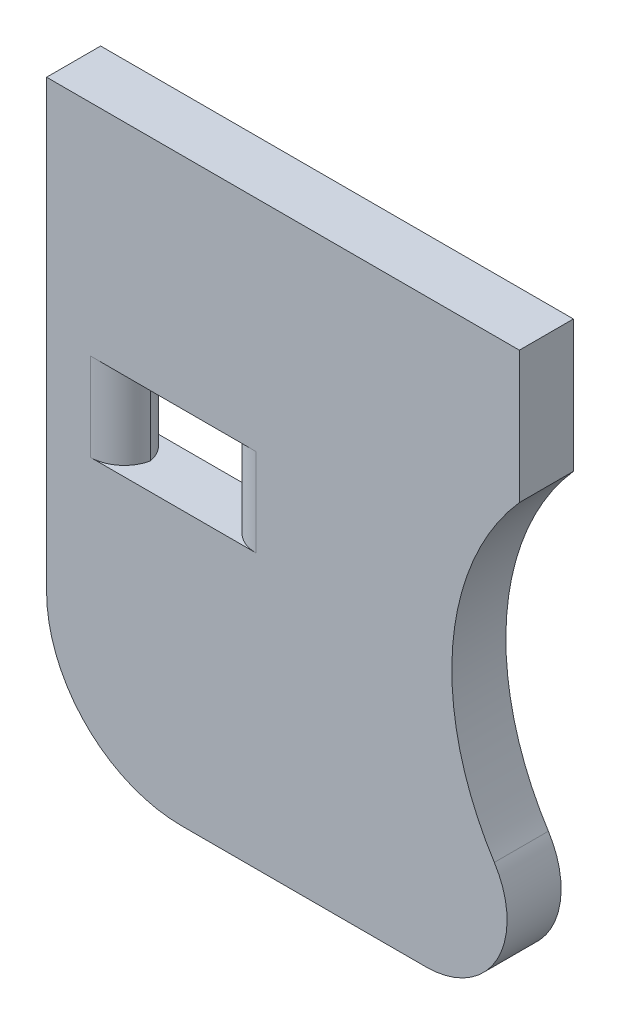
ISO-10303-21;
HEADER;
FILE_DESCRIPTION(('STEP AP214'),'2;1');
FILE_NAME('part.step','',(''),(''),'','','');
FILE_SCHEMA(('AUTOMOTIVE_DESIGN { 1 0 10303 214 1 1 1 1 }'));
ENDSEC;
DATA;
#1=APPLICATION_CONTEXT('core data for automotive mechanical design processes');
#2=APPLICATION_PROTOCOL_DEFINITION('international standard','automotive_design',2000,#1);
#3=PRODUCT_CONTEXT('',#1,'mechanical');
#4=PRODUCT('Part','Part','',(#3));
#5=PRODUCT_RELATED_PRODUCT_CATEGORY('part','',(#4));
#6=PRODUCT_DEFINITION_FORMATION('','',#4);
#7=PRODUCT_DEFINITION_CONTEXT('part definition',#1,'design');
#8=PRODUCT_DEFINITION('design','',#6,#7);
#9=PRODUCT_DEFINITION_SHAPE('','',#8);
#10=(LENGTH_UNIT() NAMED_UNIT(*) SI_UNIT(.MILLI.,.METRE.));
#11=(NAMED_UNIT(*) PLANE_ANGLE_UNIT() SI_UNIT($,.RADIAN.));
#12=(NAMED_UNIT(*) SI_UNIT($,.STERADIAN.) SOLID_ANGLE_UNIT());
#13=UNCERTAINTY_MEASURE_WITH_UNIT(LENGTH_MEASURE(1.E-05),#10,'distance_accuracy_value','');
#14=(GEOMETRIC_REPRESENTATION_CONTEXT(3) GLOBAL_UNCERTAINTY_ASSIGNED_CONTEXT((#13)) GLOBAL_UNIT_ASSIGNED_CONTEXT((#10,
#11,#12)) REPRESENTATION_CONTEXT('',''));
#15=CARTESIAN_POINT('',(0.,0.,0.));
#16=DIRECTION('',(0.,0.,1.));
#17=DIRECTION('',(1.,0.,0.));
#18=AXIS2_PLACEMENT_3D('',#15,#16,#17);
#19=CARTESIAN_POINT('',(-30.,-32.525,4.));
#20=DIRECTION('',(0.,0.,-1.));
#21=DIRECTION('',(-1.,0.,0.));
#22=AXIS2_PLACEMENT_3D('',#19,#20,#21);
#23=CYLINDRICAL_SURFACE('',#22,20.);
#24=CARTESIAN_POINT('',(-30.,-32.525,4.));
#25=DIRECTION('',(0.,0.,1.));
#26=DIRECTION('',(1.,0.,0.));
#27=AXIS2_PLACEMENT_3D('',#24,#25,#26);
#28=CIRCLE('',#27,20.);
#29=CARTESIAN_POINT('',(-45.,-19.296243444677,4.));
#30=VERTEX_POINT('',#29);
#31=CARTESIAN_POINT('',(-46.8530017693897,-43.2942307692308,4.));
#32=VERTEX_POINT('',#31);
#33=EDGE_CURVE('E192',#30,#32,#28,.T.);
#34=ORIENTED_EDGE('',*,*,#33,.T.);
#35=DIRECTION('',(0.,0.,-1.));
#36=VECTOR('',#35,1.);
#37=CARTESIAN_POINT('',(-46.8530017693897,-43.2942307692307,4.));
#38=LINE('',#37,#36);
#39=CARTESIAN_POINT('',(-46.8530017693897,-43.2942307692307,0.));
#40=VERTEX_POINT('',#39);
#41=EDGE_CURVE('E177',#32,#40,#38,.T.);
#42=ORIENTED_EDGE('',*,*,#41,.T.);
#43=CARTESIAN_POINT('',(-30.,-32.525,0.));
#44=DIRECTION('',(0.,0.,1.));
#45=DIRECTION('',(1.,0.,0.));
#46=AXIS2_PLACEMENT_3D('',#43,#44,#45);
#47=CIRCLE('',#46,20.);
#48=CARTESIAN_POINT('',(-45.,-19.296243444677,0.));
#49=VERTEX_POINT('',#48);
#50=EDGE_CURVE('E189',#49,#40,#47,.T.);
#51=ORIENTED_EDGE('',*,*,#50,.F.);
#52=DIRECTION('',(0.,0.,-1.));
#53=VECTOR('',#52,1.);
#54=CARTESIAN_POINT('',(-45.,-19.296243444677,4.));
#55=LINE('',#54,#53);
#56=EDGE_CURVE('E226',#30,#49,#55,.T.);
#57=ORIENTED_EDGE('',*,*,#56,.F.);
#58=EDGE_LOOP('',(#34,#42,#51,#57));
#59=FACE_BOUND('',#58,.T.);
#60=ADVANCED_FACE('F53',(#59),#23,.F.);
#61=CARTESIAN_POINT('',(-70.,-42.525,4.));
#62=DIRECTION('',(0.,0.,-1.));
#63=DIRECTION('',(-1.,0.,0.));
#64=AXIS2_PLACEMENT_3D('',#61,#62,#63);
#65=CYLINDRICAL_SURFACE('',#64,9.99999999999999);
#66=CARTESIAN_POINT('',(-70.,-42.525,0.));
#67=DIRECTION('',(0.,0.,-1.));
#68=DIRECTION('',(-1.,0.,0.));
#69=AXIS2_PLACEMENT_3D('',#66,#67,#68);
#70=CIRCLE('',#69,9.99999999999999);
#71=CARTESIAN_POINT('',(-70.,-52.525,0.));
#72=VERTEX_POINT('',#71);
#73=CARTESIAN_POINT('',(-80.,-42.525,0.));
#74=VERTEX_POINT('',#73);
#75=EDGE_CURVE('E245',#72,#74,#70,.T.);
#76=ORIENTED_EDGE('',*,*,#75,.F.);
#77=DIRECTION('',(0.,0.,-1.));
#78=VECTOR('',#77,1.);
#79=CARTESIAN_POINT('',(-70.,-52.525,4.));
#80=LINE('',#79,#78);
#81=CARTESIAN_POINT('',(-70.,-52.525,4.));
#82=VERTEX_POINT('',#81);
#83=EDGE_CURVE('E229',#82,#72,#80,.T.);
#84=ORIENTED_EDGE('',*,*,#83,.F.);
#85=CARTESIAN_POINT('',(-70.,-42.525,4.));
#86=DIRECTION('',(0.,0.,-1.));
#87=DIRECTION('',(-1.,0.,0.));
#88=AXIS2_PLACEMENT_3D('',#85,#86,#87);
#89=CIRCLE('',#88,9.99999999999999);
#90=CARTESIAN_POINT('',(-80.,-42.525,4.));
#91=VERTEX_POINT('',#90);
#92=EDGE_CURVE('E205',#82,#91,#89,.T.);
#93=ORIENTED_EDGE('',*,*,#92,.T.);
#94=DIRECTION('',(0.,0.,-1.));
#95=VECTOR('',#94,1.);
#96=CARTESIAN_POINT('',(-80.,-42.525,4.));
#97=LINE('',#96,#95);
#98=EDGE_CURVE('E257',#91,#74,#97,.T.);
#99=ORIENTED_EDGE('',*,*,#98,.T.);
#100=EDGE_LOOP('',(#76,#84,#93,#99));
#101=FACE_BOUND('',#100,.T.);
#102=ADVANCED_FACE('F403',(#101),#65,.T.);
#103=CARTESIAN_POINT('',(-70.,-52.525,4.));
#104=DIRECTION('',(0.,1.,0.));
#105=DIRECTION('',(0.,0.,1.));
#106=AXIS2_PLACEMENT_3D('',#103,#104,#105);
#107=PLANE('',#106);
#108=DIRECTION('',(1.,0.,0.));
#109=VECTOR('',#108,1.);
#110=CARTESIAN_POINT('',(-70.,-52.525,0.));
#111=LINE('',#110,#109);
#112=CARTESIAN_POINT('',(-51.9089023002066,-52.525,0.));
#113=VERTEX_POINT('',#112);
#114=EDGE_CURVE('E201',#72,#113,#111,.T.);
#115=ORIENTED_EDGE('',*,*,#114,.T.);
#116=DIRECTION('',(0.,0.,-1.));
#117=VECTOR('',#116,1.);
#118=CARTESIAN_POINT('',(-51.9089023002066,-52.525,4.001));
#119=LINE('',#118,#117);
#120=CARTESIAN_POINT('',(-51.9089023002066,-52.525,4.));
#121=VERTEX_POINT('',#120);
#122=EDGE_CURVE('E75',#121,#113,#119,.T.);
#123=ORIENTED_EDGE('',*,*,#122,.F.);
#124=DIRECTION('',(1.,0.,0.));
#125=VECTOR('',#124,1.);
#126=CARTESIAN_POINT('',(-70.,-52.525,4.));
#127=LINE('',#126,#125);
#128=EDGE_CURVE('E262',#82,#121,#127,.T.);
#129=ORIENTED_EDGE('',*,*,#128,.F.);
#130=ORIENTED_EDGE('',*,*,#83,.T.);
#131=EDGE_LOOP('',(#115,#123,#129,#130));
#132=FACE_BOUND('',#131,.T.);
#133=ADVANCED_FACE('F463',(#132),#107,.F.);
#134=CARTESIAN_POINT('',(-45.,-9.525,4.));
#135=DIRECTION('',(1.,0.,0.));
#136=DIRECTION('',(0.,1.,0.));
#137=AXIS2_PLACEMENT_3D('',#134,#135,#136);
#138=PLANE('',#137);
#139=DIRECTION('',(0.,-1.,0.));
#140=VECTOR('',#139,1.);
#141=CARTESIAN_POINT('',(-45.,-9.525,0.));
#142=LINE('',#141,#140);
#143=CARTESIAN_POINT('',(-45.,-9.525,0.));
#144=VERTEX_POINT('',#143);
#145=EDGE_CURVE('E199',#144,#49,#142,.T.);
#146=ORIENTED_EDGE('',*,*,#145,.F.);
#147=DIRECTION('',(0.,0.,-1.));
#148=VECTOR('',#147,1.);
#149=CARTESIAN_POINT('',(-45.,-9.525,4.));
#150=LINE('',#149,#148);
#151=CARTESIAN_POINT('',(-45.,-9.525,4.));
#152=VERTEX_POINT('',#151);
#153=EDGE_CURVE('E230',#152,#144,#150,.T.);
#154=ORIENTED_EDGE('',*,*,#153,.F.);
#155=DIRECTION('',(0.,-1.,0.));
#156=VECTOR('',#155,1.);
#157=CARTESIAN_POINT('',(-45.,-9.525,4.));
#158=LINE('',#157,#156);
#159=EDGE_CURVE('E368',#152,#30,#158,.T.);
#160=ORIENTED_EDGE('',*,*,#159,.T.);
#161=ORIENTED_EDGE('',*,*,#56,.T.);
#162=EDGE_LOOP('',(#146,#154,#160,#161));
#163=FACE_BOUND('',#162,.T.);
#164=ADVANCED_FACE('F493',(#163),#138,.T.);
#165=CARTESIAN_POINT('',(-80.,-9.525,4.));
#166=DIRECTION('',(0.,1.,0.));
#167=DIRECTION('',(0.,0.,1.));
#168=AXIS2_PLACEMENT_3D('',#165,#166,#167);
#169=PLANE('',#168);
#170=DIRECTION('',(1.,0.,0.));
#171=VECTOR('',#170,1.);
#172=CARTESIAN_POINT('',(-80.,-9.525,0.));
#173=LINE('',#172,#171);
#174=CARTESIAN_POINT('',(-80.,-9.525,0.));
#175=VERTEX_POINT('',#174);
#176=EDGE_CURVE('E208',#175,#144,#173,.T.);
#177=ORIENTED_EDGE('',*,*,#176,.F.);
#178=DIRECTION('',(0.,0.,-1.));
#179=VECTOR('',#178,1.);
#180=CARTESIAN_POINT('',(-80.,-9.525,4.));
#181=LINE('',#180,#179);
#182=CARTESIAN_POINT('',(-80.,-9.525,4.));
#183=VERTEX_POINT('',#182);
#184=EDGE_CURVE('E261',#183,#175,#181,.T.);
#185=ORIENTED_EDGE('',*,*,#184,.F.);
#186=DIRECTION('',(1.,0.,0.));
#187=VECTOR('',#186,1.);
#188=CARTESIAN_POINT('',(-80.,-9.525,4.));
#189=LINE('',#188,#187);
#190=EDGE_CURVE('E364',#183,#152,#189,.T.);
#191=ORIENTED_EDGE('',*,*,#190,.T.);
#192=ORIENTED_EDGE('',*,*,#153,.T.);
#193=EDGE_LOOP('',(#177,#185,#191,#192));
#194=FACE_BOUND('',#193,.T.);
#195=ADVANCED_FACE('F477',(#194),#169,.T.);
#196=CARTESIAN_POINT('',(-80.,-9.525,4.));
#197=DIRECTION('',(1.,0.,0.));
#198=DIRECTION('',(0.,0.,-1.));
#199=AXIS2_PLACEMENT_3D('',#196,#197,#198);
#200=PLANE('',#199);
#201=DIRECTION('',(0.,-1.,0.));
#202=VECTOR('',#201,1.);
#203=CARTESIAN_POINT('',(-80.,-9.525,0.));
#204=LINE('',#203,#202);
#205=EDGE_CURVE('E240',#175,#74,#204,.T.);
#206=ORIENTED_EDGE('',*,*,#205,.T.);
#207=ORIENTED_EDGE('',*,*,#98,.F.);
#208=DIRECTION('',(0.,-1.,0.));
#209=VECTOR('',#208,1.);
#210=CARTESIAN_POINT('',(-80.,-9.525,4.));
#211=LINE('',#210,#209);
#212=EDGE_CURVE('E369',#183,#91,#211,.T.);
#213=ORIENTED_EDGE('',*,*,#212,.F.);
#214=ORIENTED_EDGE('',*,*,#184,.T.);
#215=EDGE_LOOP('',(#206,#207,#213,#214));
#216=FACE_BOUND('',#215,.T.);
#217=ADVANCED_FACE('F399',(#216),#200,.F.);
#218=CARTESIAN_POINT('',(-70.,-42.525,4.));
#219=DIRECTION('',(0.,0.,-1.));
#220=DIRECTION('',(-1.,0.,0.));
#221=AXIS2_PLACEMENT_3D('',#218,#219,#220);
#222=PLANE('',#221);
#223=DIRECTION('',(0.,1.,0.));
#224=VECTOR('',#223,1.);
#225=CARTESIAN_POINT('',(-76.75,-42.525,4.));
#226=LINE('',#225,#224);
#227=CARTESIAN_POINT('',(-76.75,-32.2749999999999,4.));
#228=VERTEX_POINT('',#227);
#229=CARTESIAN_POINT('',(-76.75,-25.775,4.));
#230=VERTEX_POINT('',#229);
#231=EDGE_CURVE('E450',#228,#230,#226,.T.);
#232=ORIENTED_EDGE('',*,*,#231,.T.);
#233=DIRECTION('',(1.,0.,0.));
#234=VECTOR('',#233,1.);
#235=CARTESIAN_POINT('',(-67.,-25.7749999999999,4.));
#236=LINE('',#235,#234);
#237=CARTESIAN_POINT('',(-64.5,-25.7749999999999,4.));
#238=VERTEX_POINT('',#237);
#239=EDGE_CURVE('E282',#230,#238,#236,.T.);
#240=ORIENTED_EDGE('',*,*,#239,.T.);
#241=DIRECTION('',(0.,-1.,0.));
#242=VECTOR('',#241,1.);
#243=CARTESIAN_POINT('',(-64.5,-42.525,4.));
#244=LINE('',#243,#242);
#245=CARTESIAN_POINT('',(-64.5,-32.2749999999999,4.));
#246=VERTEX_POINT('',#245);
#247=EDGE_CURVE('E264',#238,#246,#244,.T.);
#248=ORIENTED_EDGE('',*,*,#247,.T.);
#249=DIRECTION('',(-1.,0.,0.));
#250=VECTOR('',#249,1.);
#251=CARTESIAN_POINT('',(-67.,-32.2749999999999,4.));
#252=LINE('',#251,#250);
#253=EDGE_CURVE('E300',#246,#228,#252,.T.);
#254=ORIENTED_EDGE('',*,*,#253,.T.);
#255=EDGE_LOOP('',(#232,#240,#248,#254));
#256=FACE_BOUND('',#255,.T.);
#257=ORIENTED_EDGE('',*,*,#128,.T.);
#258=CARTESIAN_POINT('',(-51.9089023002066,-46.525,4.));
#259=DIRECTION('',(0.,0.,-1.));
#260=DIRECTION('',(-1.,0.,0.));
#261=AXIS2_PLACEMENT_3D('',#258,#259,#260);
#262=CIRCLE('',#261,6.);
#263=EDGE_CURVE('E184',#32,#121,#262,.T.);
#264=ORIENTED_EDGE('',*,*,#263,.F.);
#265=ORIENTED_EDGE('',*,*,#33,.F.);
#266=ORIENTED_EDGE('',*,*,#159,.F.);
#267=ORIENTED_EDGE('',*,*,#190,.F.);
#268=ORIENTED_EDGE('',*,*,#212,.T.);
#269=ORIENTED_EDGE('',*,*,#92,.F.);
#270=EDGE_LOOP('',(#257,#264,#265,#266,#267,#268,#269));
#271=FACE_BOUND('',#270,.T.);
#272=ADVANCED_FACE('F396',(#256,#271),#222,.F.);
#273=CARTESIAN_POINT('',(-70.,-42.525,0.));
#274=DIRECTION('',(0.,0.,-1.));
#275=DIRECTION('',(-1.,0.,0.));
#276=AXIS2_PLACEMENT_3D('',#273,#274,#275);
#277=PLANE('',#276);
#278=CARTESIAN_POINT('',(-51.9089023002066,-46.525,0.));
#279=DIRECTION('',(0.,0.,1.));
#280=DIRECTION('',(1.,0.,0.));
#281=AXIS2_PLACEMENT_3D('',#278,#279,#280);
#282=CIRCLE('',#281,6.);
#283=EDGE_CURVE('E174',#113,#40,#282,.T.);
#284=ORIENTED_EDGE('',*,*,#283,.F.);
#285=ORIENTED_EDGE('',*,*,#114,.F.);
#286=ORIENTED_EDGE('',*,*,#75,.T.);
#287=ORIENTED_EDGE('',*,*,#205,.F.);
#288=ORIENTED_EDGE('',*,*,#176,.T.);
#289=ORIENTED_EDGE('',*,*,#145,.T.);
#290=ORIENTED_EDGE('',*,*,#50,.T.);
#291=EDGE_LOOP('',(#284,#285,#286,#287,#288,#289,#290));
#292=FACE_BOUND('',#291,.T.);
#293=DIRECTION('',(1.,0.,0.));
#294=VECTOR('',#293,1.);
#295=CARTESIAN_POINT('',(-67.,-25.7749999999999,0.));
#296=LINE('',#295,#294);
#297=CARTESIAN_POINT('',(-76.75,-25.775,0.));
#298=VERTEX_POINT('',#297);
#299=CARTESIAN_POINT('',(-64.5,-25.7749999999999,0.));
#300=VERTEX_POINT('',#299);
#301=EDGE_CURVE('E294',#298,#300,#296,.T.);
#302=ORIENTED_EDGE('',*,*,#301,.F.);
#303=DIRECTION('',(0.,1.,0.));
#304=VECTOR('',#303,1.);
#305=CARTESIAN_POINT('',(-76.75,-32.2749999999999,0.));
#306=LINE('',#305,#304);
#307=CARTESIAN_POINT('',(-76.75,-32.2749999999999,0.));
#308=VERTEX_POINT('',#307);
#309=EDGE_CURVE('E329',#298,#308,#306,.F.);
#310=ORIENTED_EDGE('',*,*,#309,.T.);
#311=DIRECTION('',(-1.,0.,0.));
#312=VECTOR('',#311,1.);
#313=CARTESIAN_POINT('',(-67.,-32.2749999999999,0.));
#314=LINE('',#313,#312);
#315=CARTESIAN_POINT('',(-64.5,-32.2749999999999,0.));
#316=VERTEX_POINT('',#315);
#317=EDGE_CURVE('E298',#316,#308,#314,.T.);
#318=ORIENTED_EDGE('',*,*,#317,.F.);
#319=DIRECTION('',(0.,-1.,0.));
#320=VECTOR('',#319,1.);
#321=CARTESIAN_POINT('',(-64.5,-25.7749999999999,0.));
#322=LINE('',#321,#320);
#323=EDGE_CURVE('E429',#316,#300,#322,.F.);
#324=ORIENTED_EDGE('',*,*,#323,.T.);
#325=EDGE_LOOP('',(#302,#310,#318,#324));
#326=FACE_BOUND('',#325,.T.);
#327=ADVANCED_FACE('F195',(#292,#326),#277,.T.);
#328=CARTESIAN_POINT('',(-67.,-32.2749999999999,4.));
#329=DIRECTION('',(0.,-1.,0.));
#330=DIRECTION('',(0.,0.,-1.));
#331=AXIS2_PLACEMENT_3D('',#328,#329,#330);
#332=PLANE('',#331);
#333=ORIENTED_EDGE('',*,*,#317,.T.);
#334=CARTESIAN_POINT('',(-76.75,-32.2749999999999,2.5));
#335=DIRECTION('',(0.,-1.,0.));
#336=DIRECTION('',(0.,0.,-1.));
#337=AXIS2_PLACEMENT_3D('',#334,#335,#336);
#338=CIRCLE('',#337,2.5);
#339=CARTESIAN_POINT('',(-74.3005102572168,-32.2749999999999,2.));
#340=VERTEX_POINT('',#339);
#341=EDGE_CURVE('E350',#308,#340,#338,.T.);
#342=ORIENTED_EDGE('',*,*,#341,.T.);
#343=CARTESIAN_POINT('',(-76.75,-32.2749999999999,1.5));
#344=DIRECTION('',(0.,-1.,0.));
#345=DIRECTION('',(0.,0.,-1.));
#346=AXIS2_PLACEMENT_3D('',#343,#344,#345);
#347=CIRCLE('',#346,2.5);
#348=EDGE_CURVE('E328',#340,#228,#347,.T.);
#349=ORIENTED_EDGE('',*,*,#348,.T.);
#350=ORIENTED_EDGE('',*,*,#253,.F.);
#351=CARTESIAN_POINT('',(-64.5,-32.2749999999999,1.5));
#352=DIRECTION('',(0.,-1.,0.));
#353=DIRECTION('',(0.,0.,-1.));
#354=AXIS2_PLACEMENT_3D('',#351,#352,#353);
#355=CIRCLE('',#354,2.5);
#356=CARTESIAN_POINT('',(-66.9494897427832,-32.2749999999999,2.));
#357=VERTEX_POINT('',#356);
#358=EDGE_CURVE('E318',#246,#357,#355,.T.);
#359=ORIENTED_EDGE('',*,*,#358,.T.);
#360=CARTESIAN_POINT('',(-64.5,-32.2749999999999,2.5));
#361=DIRECTION('',(0.,-1.,0.));
#362=DIRECTION('',(0.,0.,-1.));
#363=AXIS2_PLACEMENT_3D('',#360,#361,#362);
#364=CIRCLE('',#363,2.5);
#365=EDGE_CURVE('E64',#357,#316,#364,.T.);
#366=ORIENTED_EDGE('',*,*,#365,.T.);
#367=EDGE_LOOP('',(#333,#342,#349,#350,#359,#366));
#368=FACE_BOUND('',#367,.T.);
#369=ADVANCED_FACE('F419',(#368),#332,.F.);
#370=CARTESIAN_POINT('',(-67.,-25.7749999999999,4.));
#371=DIRECTION('',(0.,1.,0.));
#372=DIRECTION('',(-1.,0.,0.));
#373=AXIS2_PLACEMENT_3D('',#370,#371,#372);
#374=PLANE('',#373);
#375=ORIENTED_EDGE('',*,*,#301,.T.);
#376=CARTESIAN_POINT('',(-64.5,-25.7749999999999,2.5));
#377=DIRECTION('',(0.,1.,0.));
#378=DIRECTION('',(-1.,0.,0.));
#379=AXIS2_PLACEMENT_3D('',#376,#377,#378);
#380=CIRCLE('',#379,2.5);
#381=CARTESIAN_POINT('',(-66.9494897427832,-25.7749999999999,2.));
#382=VERTEX_POINT('',#381);
#383=EDGE_CURVE('E12',#300,#382,#380,.T.);
#384=ORIENTED_EDGE('',*,*,#383,.T.);
#385=CARTESIAN_POINT('',(-64.5,-25.7749999999999,1.5));
#386=DIRECTION('',(0.,1.,0.));
#387=DIRECTION('',(-1.,0.,0.));
#388=AXIS2_PLACEMENT_3D('',#385,#386,#387);
#389=CIRCLE('',#388,2.5);
#390=EDGE_CURVE('E313',#382,#238,#389,.T.);
#391=ORIENTED_EDGE('',*,*,#390,.T.);
#392=ORIENTED_EDGE('',*,*,#239,.F.);
#393=CARTESIAN_POINT('',(-76.75,-25.775,1.5));
#394=DIRECTION('',(0.,1.,0.));
#395=DIRECTION('',(-1.,0.,0.));
#396=AXIS2_PLACEMENT_3D('',#393,#394,#395);
#397=CIRCLE('',#396,2.5);
#398=CARTESIAN_POINT('',(-74.3005102572168,-25.775,2.));
#399=VERTEX_POINT('',#398);
#400=EDGE_CURVE('E324',#230,#399,#397,.T.);
#401=ORIENTED_EDGE('',*,*,#400,.T.);
#402=CARTESIAN_POINT('',(-76.75,-25.775,2.5));
#403=DIRECTION('',(0.,1.,0.));
#404=DIRECTION('',(-1.,0.,0.));
#405=AXIS2_PLACEMENT_3D('',#402,#403,#404);
#406=CIRCLE('',#405,2.5);
#407=EDGE_CURVE('E317',#399,#298,#406,.T.);
#408=ORIENTED_EDGE('',*,*,#407,.T.);
#409=EDGE_LOOP('',(#375,#384,#391,#392,#401,#408));
#410=FACE_BOUND('',#409,.T.);
#411=ADVANCED_FACE('F437',(#410),#374,.F.);
#412=CARTESIAN_POINT('',(-76.75,-25.775,2.5));
#413=DIRECTION('',(0.,-1.,0.));
#414=DIRECTION('',(0.,0.,-1.));
#415=AXIS2_PLACEMENT_3D('',#412,#413,#414);
#416=CYLINDRICAL_SURFACE('',#415,2.5);
#417=DIRECTION('',(0.,-1.,0.));
#418=VECTOR('',#417,1.);
#419=CARTESIAN_POINT('',(-74.3005102572168,-29.025,2.));
#420=LINE('',#419,#418);
#421=EDGE_CURVE('E299',#340,#399,#420,.F.);
#422=ORIENTED_EDGE('',*,*,#421,.F.);
#423=ORIENTED_EDGE('',*,*,#341,.F.);
#424=ORIENTED_EDGE('',*,*,#309,.F.);
#425=ORIENTED_EDGE('',*,*,#407,.F.);
#426=EDGE_LOOP('',(#422,#423,#424,#425));
#427=FACE_BOUND('',#426,.T.);
#428=ADVANCED_FACE('F430',(#427),#416,.T.);
#429=CARTESIAN_POINT('',(-76.75,-42.525,1.5));
#430=DIRECTION('',(0.,1.,0.));
#431=DIRECTION('',(0.,0.,1.));
#432=AXIS2_PLACEMENT_3D('',#429,#430,#431);
#433=CYLINDRICAL_SURFACE('',#432,2.5);
#434=ORIENTED_EDGE('',*,*,#348,.F.);
#435=ORIENTED_EDGE('',*,*,#421,.T.);
#436=ORIENTED_EDGE('',*,*,#400,.F.);
#437=ORIENTED_EDGE('',*,*,#231,.F.);
#438=EDGE_LOOP('',(#434,#435,#436,#437));
#439=FACE_BOUND('',#438,.T.);
#440=ADVANCED_FACE('F440',(#439),#433,.T.);
#441=CARTESIAN_POINT('',(-64.5,-25.7749999999999,2.5));
#442=DIRECTION('',(0.,1.,0.));
#443=DIRECTION('',(0.,0.,1.));
#444=AXIS2_PLACEMENT_3D('',#441,#442,#443);
#445=CYLINDRICAL_SURFACE('',#444,2.5);
#446=DIRECTION('',(0.,1.,0.));
#447=VECTOR('',#446,1.);
#448=CARTESIAN_POINT('',(-66.9494897427832,-29.0249999999999,2.));
#449=LINE('',#448,#447);
#450=EDGE_CURVE('E58',#382,#357,#449,.F.);
#451=ORIENTED_EDGE('',*,*,#450,.F.);
#452=ORIENTED_EDGE('',*,*,#383,.F.);
#453=ORIENTED_EDGE('',*,*,#323,.F.);
#454=ORIENTED_EDGE('',*,*,#365,.F.);
#455=EDGE_LOOP('',(#451,#452,#453,#454));
#456=FACE_BOUND('',#455,.T.);
#457=ADVANCED_FACE('F56',(#456),#445,.T.);
#458=CARTESIAN_POINT('',(-64.5,-42.525,1.5));
#459=DIRECTION('',(0.,-1.,0.));
#460=DIRECTION('',(0.,0.,-1.));
#461=AXIS2_PLACEMENT_3D('',#458,#459,#460);
#462=CYLINDRICAL_SURFACE('',#461,2.5);
#463=ORIENTED_EDGE('',*,*,#390,.F.);
#464=ORIENTED_EDGE('',*,*,#450,.T.);
#465=ORIENTED_EDGE('',*,*,#358,.F.);
#466=ORIENTED_EDGE('',*,*,#247,.F.);
#467=EDGE_LOOP('',(#463,#464,#465,#466));
#468=FACE_BOUND('',#467,.T.);
#469=ADVANCED_FACE('F447',(#468),#462,.T.);
#470=CARTESIAN_POINT('',(-51.9089023002066,-46.525,4.001));
#471=DIRECTION('',(0.,0.,-1.));
#472=DIRECTION('',(-1.,0.,0.));
#473=AXIS2_PLACEMENT_3D('',#470,#471,#472);
#474=CYLINDRICAL_SURFACE('',#473,6.);
#475=ORIENTED_EDGE('',*,*,#263,.T.);
#476=ORIENTED_EDGE('',*,*,#122,.T.);
#477=ORIENTED_EDGE('',*,*,#283,.T.);
#478=ORIENTED_EDGE('',*,*,#41,.F.);
#479=EDGE_LOOP('',(#475,#476,#477,#478));
#480=FACE_BOUND('',#479,.T.);
#481=ADVANCED_FACE('F176',(#480),#474,.T.);
#482=CLOSED_SHELL('',(#60,#102,#133,#164,#195,#217,#272,#327,#369,#411,#428,#440,#457,#469,#481));
#483=MANIFOLD_SOLID_BREP('B2',#482);
#484=ADVANCED_BREP_SHAPE_REPRESENTATION('',(#18,#483),#14);
#485=SHAPE_DEFINITION_REPRESENTATION(#9,#484);
ENDSEC;
END-ISO-10303-21;
